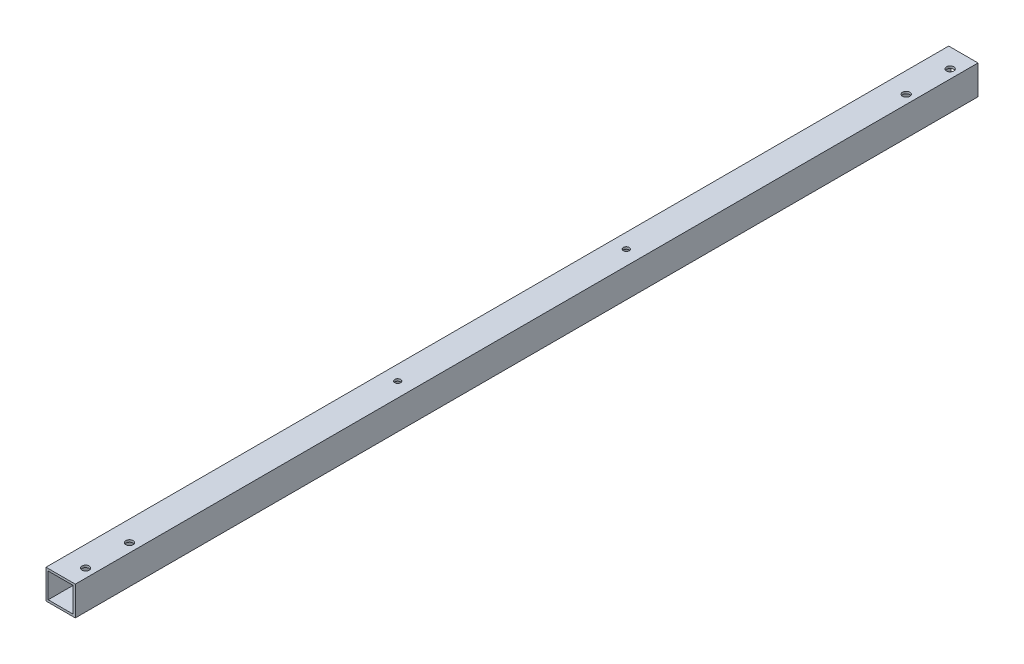
ISO-10303-21;
HEADER;
FILE_DESCRIPTION(('STEP AP214'),'2;1');
FILE_NAME('part.step','',(''),(''),'','','');
FILE_SCHEMA(('AUTOMOTIVE_DESIGN { 1 0 10303 214 1 1 1 1 }'));
ENDSEC;
DATA;
#1=APPLICATION_CONTEXT('core data for automotive mechanical design processes');
#2=APPLICATION_PROTOCOL_DEFINITION('international standard','automotive_design',2000,#1);
#3=PRODUCT_CONTEXT('',#1,'mechanical');
#4=PRODUCT('Part','Part','',(#3));
#5=PRODUCT_RELATED_PRODUCT_CATEGORY('part','',(#4));
#6=PRODUCT_DEFINITION_FORMATION('','',#4);
#7=PRODUCT_DEFINITION_CONTEXT('part definition',#1,'design');
#8=PRODUCT_DEFINITION('design','',#6,#7);
#9=PRODUCT_DEFINITION_SHAPE('','',#8);
#10=(LENGTH_UNIT() NAMED_UNIT(*) SI_UNIT(.MILLI.,.METRE.));
#11=(NAMED_UNIT(*) PLANE_ANGLE_UNIT() SI_UNIT($,.RADIAN.));
#12=(NAMED_UNIT(*) SI_UNIT($,.STERADIAN.) SOLID_ANGLE_UNIT());
#13=UNCERTAINTY_MEASURE_WITH_UNIT(LENGTH_MEASURE(1.E-05),#10,'distance_accuracy_value','');
#14=(GEOMETRIC_REPRESENTATION_CONTEXT(3) GLOBAL_UNCERTAINTY_ASSIGNED_CONTEXT((#13)) GLOBAL_UNIT_ASSIGNED_CONTEXT((#10,
#11,#12)) REPRESENTATION_CONTEXT('',''));
#15=CARTESIAN_POINT('',(0.,0.,0.));
#16=DIRECTION('',(0.,0.,1.));
#17=DIRECTION('',(1.,0.,0.));
#18=AXIS2_PLACEMENT_3D('',#15,#16,#17);
#19=CARTESIAN_POINT('',(0.,0.,616.));
#20=DIRECTION('',(0.,0.,1.));
#21=DIRECTION('',(1.,0.,0.));
#22=AXIS2_PLACEMENT_3D('',#19,#20,#21);
#23=PLANE('',#22);
#24=DIRECTION('',(0.,1.,0.));
#25=VECTOR('',#24,1.);
#26=CARTESIAN_POINT('',(10.,10.,616.));
#27=LINE('',#26,#25);
#28=CARTESIAN_POINT('',(10.,-10.,616.));
#29=VERTEX_POINT('',#28);
#30=CARTESIAN_POINT('',(10.,10.,616.));
#31=VERTEX_POINT('',#30);
#32=EDGE_CURVE('E141',#29,#31,#27,.T.);
#33=ORIENTED_EDGE('',*,*,#32,.T.);
#34=DIRECTION('',(-1.,0.,0.));
#35=VECTOR('',#34,1.);
#36=CARTESIAN_POINT('',(-10.,10.,616.));
#37=LINE('',#36,#35);
#38=CARTESIAN_POINT('',(-10.,10.,616.));
#39=VERTEX_POINT('',#38);
#40=EDGE_CURVE('E144',#31,#39,#37,.T.);
#41=ORIENTED_EDGE('',*,*,#40,.T.);
#42=DIRECTION('',(0.,-1.,0.));
#43=VECTOR('',#42,1.);
#44=CARTESIAN_POINT('',(-10.,10.,616.));
#45=LINE('',#44,#43);
#46=CARTESIAN_POINT('',(-10.,-10.,616.));
#47=VERTEX_POINT('',#46);
#48=EDGE_CURVE('E147',#39,#47,#45,.T.);
#49=ORIENTED_EDGE('',*,*,#48,.T.);
#50=DIRECTION('',(1.,0.,0.));
#51=VECTOR('',#50,1.);
#52=CARTESIAN_POINT('',(-10.,-10.,616.));
#53=LINE('',#52,#51);
#54=EDGE_CURVE('E149',#47,#29,#53,.T.);
#55=ORIENTED_EDGE('',*,*,#54,.T.);
#56=EDGE_LOOP('',(#33,#41,#49,#55));
#57=FACE_BOUND('',#56,.T.);
#58=DIRECTION('',(-1.,0.,0.));
#59=VECTOR('',#58,1.);
#60=CARTESIAN_POINT('',(-8.5,8.5,616.));
#61=LINE('',#60,#59);
#62=CARTESIAN_POINT('',(8.5,8.5,616.));
#63=VERTEX_POINT('',#62);
#64=CARTESIAN_POINT('',(-8.5,8.5,616.));
#65=VERTEX_POINT('',#64);
#66=EDGE_CURVE('E111',#63,#65,#61,.T.);
#67=ORIENTED_EDGE('',*,*,#66,.F.);
#68=DIRECTION('',(0.,1.,0.));
#69=VECTOR('',#68,1.);
#70=CARTESIAN_POINT('',(8.5,8.5,616.));
#71=LINE('',#70,#69);
#72=CARTESIAN_POINT('',(8.50000000000001,-8.5,616.));
#73=VERTEX_POINT('',#72);
#74=EDGE_CURVE('E103',#73,#63,#71,.T.);
#75=ORIENTED_EDGE('',*,*,#74,.F.);
#76=DIRECTION('',(1.,0.,0.));
#77=VECTOR('',#76,1.);
#78=CARTESIAN_POINT('',(-8.5,-8.5,616.));
#79=LINE('',#78,#77);
#80=CARTESIAN_POINT('',(-8.5,-8.5,616.));
#81=VERTEX_POINT('',#80);
#82=EDGE_CURVE('E125',#81,#73,#79,.T.);
#83=ORIENTED_EDGE('',*,*,#82,.F.);
#84=DIRECTION('',(0.,-1.,0.));
#85=VECTOR('',#84,1.);
#86=CARTESIAN_POINT('',(-8.5,8.5,616.));
#87=LINE('',#86,#85);
#88=EDGE_CURVE('E123',#65,#81,#87,.T.);
#89=ORIENTED_EDGE('',*,*,#88,.F.);
#90=EDGE_LOOP('',(#67,#75,#83,#89));
#91=FACE_BOUND('',#90,.T.);
#92=ADVANCED_FACE('F36',(#57,#91),#23,.T.);
#93=CARTESIAN_POINT('',(0.,0.,0.));
#94=DIRECTION('',(0.,0.,1.));
#95=DIRECTION('',(1.,0.,0.));
#96=AXIS2_PLACEMENT_3D('',#93,#94,#95);
#97=PLANE('',#96);
#98=DIRECTION('',(0.,1.,0.));
#99=VECTOR('',#98,1.);
#100=CARTESIAN_POINT('',(10.,10.,0.));
#101=LINE('',#100,#99);
#102=CARTESIAN_POINT('',(10.,-10.,0.));
#103=VERTEX_POINT('',#102);
#104=CARTESIAN_POINT('',(10.,10.,0.));
#105=VERTEX_POINT('',#104);
#106=EDGE_CURVE('E119',#103,#105,#101,.T.);
#107=ORIENTED_EDGE('',*,*,#106,.F.);
#108=DIRECTION('',(1.,0.,0.));
#109=VECTOR('',#108,1.);
#110=CARTESIAN_POINT('',(-10.,-10.,0.));
#111=LINE('',#110,#109);
#112=CARTESIAN_POINT('',(-10.,-10.,0.));
#113=VERTEX_POINT('',#112);
#114=EDGE_CURVE('E145',#113,#103,#111,.T.);
#115=ORIENTED_EDGE('',*,*,#114,.F.);
#116=DIRECTION('',(0.,-1.,0.));
#117=VECTOR('',#116,1.);
#118=CARTESIAN_POINT('',(-10.,10.,0.));
#119=LINE('',#118,#117);
#120=CARTESIAN_POINT('',(-10.,10.,0.));
#121=VERTEX_POINT('',#120);
#122=EDGE_CURVE('E156',#121,#113,#119,.T.);
#123=ORIENTED_EDGE('',*,*,#122,.F.);
#124=DIRECTION('',(-1.,0.,0.));
#125=VECTOR('',#124,1.);
#126=CARTESIAN_POINT('',(-10.,10.,0.));
#127=LINE('',#126,#125);
#128=EDGE_CURVE('E154',#105,#121,#127,.T.);
#129=ORIENTED_EDGE('',*,*,#128,.F.);
#130=EDGE_LOOP('',(#107,#115,#123,#129));
#131=FACE_BOUND('',#130,.T.);
#132=DIRECTION('',(0.,1.,0.));
#133=VECTOR('',#132,1.);
#134=CARTESIAN_POINT('',(8.5,8.5,0.));
#135=LINE('',#134,#133);
#136=CARTESIAN_POINT('',(8.50000000000001,-8.5,0.));
#137=VERTEX_POINT('',#136);
#138=CARTESIAN_POINT('',(8.5,8.5,0.));
#139=VERTEX_POINT('',#138);
#140=EDGE_CURVE('E61',#137,#139,#135,.T.);
#141=ORIENTED_EDGE('',*,*,#140,.T.);
#142=DIRECTION('',(-1.,0.,0.));
#143=VECTOR('',#142,1.);
#144=CARTESIAN_POINT('',(-8.5,8.5,0.));
#145=LINE('',#144,#143);
#146=CARTESIAN_POINT('',(-8.5,8.5,0.));
#147=VERTEX_POINT('',#146);
#148=EDGE_CURVE('E118',#139,#147,#145,.T.);
#149=ORIENTED_EDGE('',*,*,#148,.T.);
#150=DIRECTION('',(0.,-1.,0.));
#151=VECTOR('',#150,1.);
#152=CARTESIAN_POINT('',(-8.5,8.5,0.));
#153=LINE('',#152,#151);
#154=CARTESIAN_POINT('',(-8.5,-8.5,0.));
#155=VERTEX_POINT('',#154);
#156=EDGE_CURVE('E133',#147,#155,#153,.T.);
#157=ORIENTED_EDGE('',*,*,#156,.T.);
#158=DIRECTION('',(1.,0.,0.));
#159=VECTOR('',#158,1.);
#160=CARTESIAN_POINT('',(-8.5,-8.5,0.));
#161=LINE('',#160,#159);
#162=EDGE_CURVE('E112',#155,#137,#161,.T.);
#163=ORIENTED_EDGE('',*,*,#162,.T.);
#164=EDGE_LOOP('',(#141,#149,#157,#163));
#165=FACE_BOUND('',#164,.T.);
#166=ADVANCED_FACE('F273',(#131,#165),#97,.F.);
#167=CARTESIAN_POINT('',(10.,10.,616.));
#168=DIRECTION('',(-1.,0.,0.));
#169=DIRECTION('',(0.,0.,1.));
#170=AXIS2_PLACEMENT_3D('',#167,#168,#169);
#171=PLANE('',#170);
#172=ORIENTED_EDGE('',*,*,#106,.T.);
#173=DIRECTION('',(0.,0.,-1.));
#174=VECTOR('',#173,1.);
#175=CARTESIAN_POINT('',(10.,10.,616.));
#176=LINE('',#175,#174);
#177=EDGE_CURVE('E11',#31,#105,#176,.T.);
#178=ORIENTED_EDGE('',*,*,#177,.F.);
#179=ORIENTED_EDGE('',*,*,#32,.F.);
#180=DIRECTION('',(0.,0.,-1.));
#181=VECTOR('',#180,1.);
#182=CARTESIAN_POINT('',(10.,-10.,616.));
#183=LINE('',#182,#181);
#184=EDGE_CURVE('E151',#29,#103,#183,.T.);
#185=ORIENTED_EDGE('',*,*,#184,.T.);
#186=EDGE_LOOP('',(#172,#178,#179,#185));
#187=FACE_BOUND('',#186,.T.);
#188=ADVANCED_FACE('F38',(#187),#171,.F.);
#189=CARTESIAN_POINT('',(-10.,10.,616.));
#190=DIRECTION('',(0.,-1.,0.));
#191=DIRECTION('',(0.,0.,-1.));
#192=AXIS2_PLACEMENT_3D('',#189,#190,#191);
#193=PLANE('',#192);
#194=CARTESIAN_POINT('',(0.,10.,230.));
#195=DIRECTION('',(0.,-1.,0.));
#196=DIRECTION('',(0.,0.,-1.));
#197=AXIS2_PLACEMENT_3D('',#194,#195,#196);
#198=CIRCLE('',#197,1.99999999999999);
#199=CARTESIAN_POINT('',(0.,10.,228.));
#200=VERTEX_POINT('',#199);
#201=EDGE_CURVE('E184',#200,#200,#198,.T.);
#202=ORIENTED_EDGE('',*,*,#201,.T.);
#203=EDGE_LOOP('',(#202));
#204=FACE_BOUND('',#203,.T.);
#205=CARTESIAN_POINT('',(0.,10.,386.));
#206=DIRECTION('',(0.,-1.,0.));
#207=DIRECTION('',(0.,0.,-1.));
#208=AXIS2_PLACEMENT_3D('',#205,#206,#207);
#209=CIRCLE('',#208,1.99999999999998);
#210=CARTESIAN_POINT('',(0.,10.,384.));
#211=VERTEX_POINT('',#210);
#212=EDGE_CURVE('E195',#211,#211,#209,.T.);
#213=ORIENTED_EDGE('',*,*,#212,.T.);
#214=EDGE_LOOP('',(#213));
#215=FACE_BOUND('',#214,.T.);
#216=CARTESIAN_POINT('',(4.,10.,13.));
#217=DIRECTION('',(0.,-1.,0.));
#218=DIRECTION('',(0.,0.,-1.));
#219=AXIS2_PLACEMENT_3D('',#216,#217,#218);
#220=CIRCLE('',#219,2.5);
#221=CARTESIAN_POINT('',(4.,10.,10.5));
#222=VERTEX_POINT('',#221);
#223=EDGE_CURVE('E170',#222,#222,#220,.T.);
#224=ORIENTED_EDGE('',*,*,#223,.T.);
#225=EDGE_LOOP('',(#224));
#226=FACE_BOUND('',#225,.T.);
#227=CARTESIAN_POINT('',(4.,10.,573.));
#228=DIRECTION('',(0.,-1.,0.));
#229=DIRECTION('',(0.,0.,-1.));
#230=AXIS2_PLACEMENT_3D('',#227,#228,#229);
#231=CIRCLE('',#230,2.5);
#232=CARTESIAN_POINT('',(4.,10.,570.5));
#233=VERTEX_POINT('',#232);
#234=EDGE_CURVE('E213',#233,#233,#231,.T.);
#235=ORIENTED_EDGE('',*,*,#234,.T.);
#236=EDGE_LOOP('',(#235));
#237=FACE_BOUND('',#236,.T.);
#238=CARTESIAN_POINT('',(4.,10.,603.));
#239=DIRECTION('',(0.,-1.,0.));
#240=DIRECTION('',(0.,0.,-1.));
#241=AXIS2_PLACEMENT_3D('',#238,#239,#240);
#242=CIRCLE('',#241,2.5);
#243=CARTESIAN_POINT('',(4.,10.,600.5));
#244=VERTEX_POINT('',#243);
#245=EDGE_CURVE('E224',#244,#244,#242,.T.);
#246=ORIENTED_EDGE('',*,*,#245,.T.);
#247=EDGE_LOOP('',(#246));
#248=FACE_BOUND('',#247,.T.);
#249=CARTESIAN_POINT('',(4.,10.,43.));
#250=DIRECTION('',(0.,-1.,0.));
#251=DIRECTION('',(0.,0.,-1.));
#252=AXIS2_PLACEMENT_3D('',#249,#250,#251);
#253=CIRCLE('',#252,2.5);
#254=CARTESIAN_POINT('',(4.,10.,40.5));
#255=VERTEX_POINT('',#254);
#256=EDGE_CURVE('E212',#255,#255,#253,.T.);
#257=ORIENTED_EDGE('',*,*,#256,.T.);
#258=EDGE_LOOP('',(#257));
#259=FACE_BOUND('',#258,.T.);
#260=ORIENTED_EDGE('',*,*,#128,.T.);
#261=DIRECTION('',(0.,0.,-1.));
#262=VECTOR('',#261,1.);
#263=CARTESIAN_POINT('',(-10.,10.,616.));
#264=LINE('',#263,#262);
#265=EDGE_CURVE('E45',#39,#121,#264,.T.);
#266=ORIENTED_EDGE('',*,*,#265,.F.);
#267=ORIENTED_EDGE('',*,*,#40,.F.);
#268=ORIENTED_EDGE('',*,*,#177,.T.);
#269=EDGE_LOOP('',(#260,#266,#267,#268));
#270=FACE_BOUND('',#269,.T.);
#271=ADVANCED_FACE('F260',(#204,#215,#226,#237,#248,#259,#270),#193,.F.);
#272=CARTESIAN_POINT('',(-10.,10.,616.));
#273=DIRECTION('',(1.,0.,0.));
#274=DIRECTION('',(0.,1.,0.));
#275=AXIS2_PLACEMENT_3D('',#272,#273,#274);
#276=PLANE('',#275);
#277=ORIENTED_EDGE('',*,*,#122,.T.);
#278=DIRECTION('',(0.,0.,-1.));
#279=VECTOR('',#278,1.);
#280=CARTESIAN_POINT('',(-10.,-10.,616.));
#281=LINE('',#280,#279);
#282=EDGE_CURVE('E161',#47,#113,#281,.T.);
#283=ORIENTED_EDGE('',*,*,#282,.F.);
#284=ORIENTED_EDGE('',*,*,#48,.F.);
#285=ORIENTED_EDGE('',*,*,#265,.T.);
#286=EDGE_LOOP('',(#277,#283,#284,#285));
#287=FACE_BOUND('',#286,.T.);
#288=ADVANCED_FACE('F263',(#287),#276,.F.);
#289=CARTESIAN_POINT('',(-10.,-10.,616.));
#290=DIRECTION('',(0.,1.,0.));
#291=DIRECTION('',(0.,0.,1.));
#292=AXIS2_PLACEMENT_3D('',#289,#290,#291);
#293=PLANE('',#292);
#294=CARTESIAN_POINT('',(0.,-10.,230.));
#295=DIRECTION('',(0.,-1.,0.));
#296=DIRECTION('',(0.,0.,-1.));
#297=AXIS2_PLACEMENT_3D('',#294,#295,#296);
#298=CIRCLE('',#297,1.99999999999999);
#299=CARTESIAN_POINT('',(0.,-10.,228.));
#300=VERTEX_POINT('',#299);
#301=EDGE_CURVE('E190',#300,#300,#298,.T.);
#302=ORIENTED_EDGE('',*,*,#301,.F.);
#303=EDGE_LOOP('',(#302));
#304=FACE_BOUND('',#303,.T.);
#305=CARTESIAN_POINT('',(0.,-10.,386.));
#306=DIRECTION('',(0.,-1.,0.));
#307=DIRECTION('',(0.,0.,-1.));
#308=AXIS2_PLACEMENT_3D('',#305,#306,#307);
#309=CIRCLE('',#308,1.99999999999998);
#310=CARTESIAN_POINT('',(0.,-10.,384.));
#311=VERTEX_POINT('',#310);
#312=EDGE_CURVE('E200',#311,#311,#309,.T.);
#313=ORIENTED_EDGE('',*,*,#312,.F.);
#314=EDGE_LOOP('',(#313));
#315=FACE_BOUND('',#314,.T.);
#316=CARTESIAN_POINT('',(4.,-10.,13.));
#317=DIRECTION('',(0.,-1.,0.));
#318=DIRECTION('',(0.,0.,-1.));
#319=AXIS2_PLACEMENT_3D('',#316,#317,#318);
#320=CIRCLE('',#319,2.5);
#321=CARTESIAN_POINT('',(4.,-10.,10.5));
#322=VERTEX_POINT('',#321);
#323=EDGE_CURVE('E209',#322,#322,#320,.T.);
#324=ORIENTED_EDGE('',*,*,#323,.F.);
#325=EDGE_LOOP('',(#324));
#326=FACE_BOUND('',#325,.T.);
#327=CARTESIAN_POINT('',(4.,-10.,573.));
#328=DIRECTION('',(0.,-1.,0.));
#329=DIRECTION('',(0.,0.,-1.));
#330=AXIS2_PLACEMENT_3D('',#327,#328,#329);
#331=CIRCLE('',#330,2.5);
#332=CARTESIAN_POINT('',(4.,-10.,570.5));
#333=VERTEX_POINT('',#332);
#334=EDGE_CURVE('E206',#333,#333,#331,.T.);
#335=ORIENTED_EDGE('',*,*,#334,.F.);
#336=EDGE_LOOP('',(#335));
#337=FACE_BOUND('',#336,.T.);
#338=CARTESIAN_POINT('',(4.,-10.,603.));
#339=DIRECTION('',(0.,-1.,0.));
#340=DIRECTION('',(0.,0.,-1.));
#341=AXIS2_PLACEMENT_3D('',#338,#339,#340);
#342=CIRCLE('',#341,2.5);
#343=CARTESIAN_POINT('',(4.,-10.,600.5));
#344=VERTEX_POINT('',#343);
#345=EDGE_CURVE('E216',#344,#344,#342,.T.);
#346=ORIENTED_EDGE('',*,*,#345,.F.);
#347=EDGE_LOOP('',(#346));
#348=FACE_BOUND('',#347,.T.);
#349=CARTESIAN_POINT('',(4.,-10.,43.));
#350=DIRECTION('',(0.,-1.,0.));
#351=DIRECTION('',(0.,0.,-1.));
#352=AXIS2_PLACEMENT_3D('',#349,#350,#351);
#353=CIRCLE('',#352,2.5);
#354=CARTESIAN_POINT('',(4.,-10.,40.5));
#355=VERTEX_POINT('',#354);
#356=EDGE_CURVE('E221',#355,#355,#353,.T.);
#357=ORIENTED_EDGE('',*,*,#356,.F.);
#358=EDGE_LOOP('',(#357));
#359=FACE_BOUND('',#358,.T.);
#360=ORIENTED_EDGE('',*,*,#114,.T.);
#361=ORIENTED_EDGE('',*,*,#184,.F.);
#362=ORIENTED_EDGE('',*,*,#54,.F.);
#363=ORIENTED_EDGE('',*,*,#282,.T.);
#364=EDGE_LOOP('',(#360,#361,#362,#363));
#365=FACE_BOUND('',#364,.T.);
#366=ADVANCED_FACE('F277',(#304,#315,#326,#337,#348,#359,#365),#293,.F.);
#367=CARTESIAN_POINT('',(8.5,8.5,616.));
#368=DIRECTION('',(-1.,0.,0.));
#369=DIRECTION('',(0.,-1.,0.));
#370=AXIS2_PLACEMENT_3D('',#367,#368,#369);
#371=PLANE('',#370);
#372=ORIENTED_EDGE('',*,*,#140,.F.);
#373=DIRECTION('',(0.,0.,-1.));
#374=VECTOR('',#373,1.);
#375=CARTESIAN_POINT('',(8.50000000000001,-8.5,616.));
#376=LINE('',#375,#374);
#377=EDGE_CURVE('E107',#73,#137,#376,.T.);
#378=ORIENTED_EDGE('',*,*,#377,.F.);
#379=ORIENTED_EDGE('',*,*,#74,.T.);
#380=DIRECTION('',(0.,0.,-1.));
#381=VECTOR('',#380,1.);
#382=CARTESIAN_POINT('',(8.5,8.5,616.));
#383=LINE('',#382,#381);
#384=EDGE_CURVE('E106',#63,#139,#383,.T.);
#385=ORIENTED_EDGE('',*,*,#384,.T.);
#386=EDGE_LOOP('',(#372,#378,#379,#385));
#387=FACE_BOUND('',#386,.T.);
#388=ADVANCED_FACE('F105',(#387),#371,.T.);
#389=CARTESIAN_POINT('',(-8.5,8.5,616.));
#390=DIRECTION('',(0.,-1.,0.));
#391=DIRECTION('',(0.,0.,-1.));
#392=AXIS2_PLACEMENT_3D('',#389,#390,#391);
#393=PLANE('',#392);
#394=CARTESIAN_POINT('',(0.,8.5,230.));
#395=DIRECTION('',(0.,-1.,0.));
#396=DIRECTION('',(0.,0.,-1.));
#397=AXIS2_PLACEMENT_3D('',#394,#395,#396);
#398=CIRCLE('',#397,1.99999999999999);
#399=CARTESIAN_POINT('',(0.,8.5,228.));
#400=VERTEX_POINT('',#399);
#401=EDGE_CURVE('E203',#400,#400,#398,.T.);
#402=ORIENTED_EDGE('',*,*,#401,.F.);
#403=EDGE_LOOP('',(#402));
#404=FACE_BOUND('',#403,.T.);
#405=CARTESIAN_POINT('',(0.,8.5,386.));
#406=DIRECTION('',(0.,-1.,0.));
#407=DIRECTION('',(0.,0.,-1.));
#408=AXIS2_PLACEMENT_3D('',#405,#406,#407);
#409=CIRCLE('',#408,1.99999999999998);
#410=CARTESIAN_POINT('',(0.,8.5,384.));
#411=VERTEX_POINT('',#410);
#412=EDGE_CURVE('E183',#411,#411,#409,.T.);
#413=ORIENTED_EDGE('',*,*,#412,.F.);
#414=EDGE_LOOP('',(#413));
#415=FACE_BOUND('',#414,.T.);
#416=CARTESIAN_POINT('',(4.,8.5,13.));
#417=DIRECTION('',(0.,-1.,0.));
#418=DIRECTION('',(0.,0.,-1.));
#419=AXIS2_PLACEMENT_3D('',#416,#417,#418);
#420=CIRCLE('',#419,2.5);
#421=CARTESIAN_POINT('',(4.,8.5,10.5));
#422=VERTEX_POINT('',#421);
#423=EDGE_CURVE('E131',#422,#422,#420,.T.);
#424=ORIENTED_EDGE('',*,*,#423,.F.);
#425=EDGE_LOOP('',(#424));
#426=FACE_BOUND('',#425,.T.);
#427=CARTESIAN_POINT('',(4.,8.5,573.));
#428=DIRECTION('',(0.,-1.,0.));
#429=DIRECTION('',(0.,0.,-1.));
#430=AXIS2_PLACEMENT_3D('',#427,#428,#429);
#431=CIRCLE('',#430,2.5);
#432=CARTESIAN_POINT('',(4.,8.5,570.5));
#433=VERTEX_POINT('',#432);
#434=EDGE_CURVE('E178',#433,#433,#431,.T.);
#435=ORIENTED_EDGE('',*,*,#434,.F.);
#436=EDGE_LOOP('',(#435));
#437=FACE_BOUND('',#436,.T.);
#438=CARTESIAN_POINT('',(4.,8.5,603.));
#439=DIRECTION('',(0.,-1.,0.));
#440=DIRECTION('',(0.,0.,-1.));
#441=AXIS2_PLACEMENT_3D('',#438,#439,#440);
#442=CIRCLE('',#441,2.5);
#443=CARTESIAN_POINT('',(4.,8.5,600.5));
#444=VERTEX_POINT('',#443);
#445=EDGE_CURVE('E174',#444,#444,#442,.T.);
#446=ORIENTED_EDGE('',*,*,#445,.F.);
#447=EDGE_LOOP('',(#446));
#448=FACE_BOUND('',#447,.T.);
#449=CARTESIAN_POINT('',(4.,8.5,43.));
#450=DIRECTION('',(0.,-1.,0.));
#451=DIRECTION('',(0.,0.,-1.));
#452=AXIS2_PLACEMENT_3D('',#449,#450,#451);
#453=CIRCLE('',#452,2.5);
#454=CARTESIAN_POINT('',(4.,8.5,40.5));
#455=VERTEX_POINT('',#454);
#456=EDGE_CURVE('E169',#455,#455,#453,.T.);
#457=ORIENTED_EDGE('',*,*,#456,.F.);
#458=EDGE_LOOP('',(#457));
#459=FACE_BOUND('',#458,.T.);
#460=ORIENTED_EDGE('',*,*,#148,.F.);
#461=ORIENTED_EDGE('',*,*,#384,.F.);
#462=ORIENTED_EDGE('',*,*,#66,.T.);
#463=DIRECTION('',(0.,0.,-1.));
#464=VECTOR('',#463,1.);
#465=CARTESIAN_POINT('',(-8.5,8.5,616.));
#466=LINE('',#465,#464);
#467=EDGE_CURVE('E120',#65,#147,#466,.T.);
#468=ORIENTED_EDGE('',*,*,#467,.T.);
#469=EDGE_LOOP('',(#460,#461,#462,#468));
#470=FACE_BOUND('',#469,.T.);
#471=ADVANCED_FACE('F115',(#404,#415,#426,#437,#448,#459,#470),#393,.T.);
#472=CARTESIAN_POINT('',(-8.5,8.5,616.));
#473=DIRECTION('',(1.,0.,0.));
#474=DIRECTION('',(0.,1.,0.));
#475=AXIS2_PLACEMENT_3D('',#472,#473,#474);
#476=PLANE('',#475);
#477=ORIENTED_EDGE('',*,*,#156,.F.);
#478=ORIENTED_EDGE('',*,*,#467,.F.);
#479=ORIENTED_EDGE('',*,*,#88,.T.);
#480=DIRECTION('',(0.,0.,-1.));
#481=VECTOR('',#480,1.);
#482=CARTESIAN_POINT('',(-8.5,-8.5,616.));
#483=LINE('',#482,#481);
#484=EDGE_CURVE('E53',#81,#155,#483,.T.);
#485=ORIENTED_EDGE('',*,*,#484,.T.);
#486=EDGE_LOOP('',(#477,#478,#479,#485));
#487=FACE_BOUND('',#486,.T.);
#488=ADVANCED_FACE('F242',(#487),#476,.T.);
#489=CARTESIAN_POINT('',(-8.5,-8.5,616.));
#490=DIRECTION('',(0.,1.,0.));
#491=DIRECTION('',(0.,0.,1.));
#492=AXIS2_PLACEMENT_3D('',#489,#490,#491);
#493=PLANE('',#492);
#494=CARTESIAN_POINT('',(0.,-8.5,230.));
#495=DIRECTION('',(0.,1.,0.));
#496=DIRECTION('',(0.,0.,1.));
#497=AXIS2_PLACEMENT_3D('',#494,#495,#496);
#498=CIRCLE('',#497,1.99999999999999);
#499=CARTESIAN_POINT('',(0.,-8.5,232.));
#500=VERTEX_POINT('',#499);
#501=EDGE_CURVE('E40',#500,#500,#498,.T.);
#502=ORIENTED_EDGE('',*,*,#501,.F.);
#503=EDGE_LOOP('',(#502));
#504=FACE_BOUND('',#503,.T.);
#505=CARTESIAN_POINT('',(0.,-8.5,386.));
#506=DIRECTION('',(0.,1.,0.));
#507=DIRECTION('',(0.,0.,1.));
#508=AXIS2_PLACEMENT_3D('',#505,#506,#507);
#509=CIRCLE('',#508,1.99999999999998);
#510=CARTESIAN_POINT('',(0.,-8.5,388.));
#511=VERTEX_POINT('',#510);
#512=EDGE_CURVE('E181',#511,#511,#509,.T.);
#513=ORIENTED_EDGE('',*,*,#512,.F.);
#514=EDGE_LOOP('',(#513));
#515=FACE_BOUND('',#514,.T.);
#516=CARTESIAN_POINT('',(4.,-8.5,13.));
#517=DIRECTION('',(0.,1.,0.));
#518=DIRECTION('',(0.,0.,1.));
#519=AXIS2_PLACEMENT_3D('',#516,#517,#518);
#520=CIRCLE('',#519,2.5);
#521=CARTESIAN_POINT('',(4.,-8.5,15.5));
#522=VERTEX_POINT('',#521);
#523=EDGE_CURVE('E179',#522,#522,#520,.T.);
#524=ORIENTED_EDGE('',*,*,#523,.F.);
#525=EDGE_LOOP('',(#524));
#526=FACE_BOUND('',#525,.T.);
#527=CARTESIAN_POINT('',(4.,-8.5,573.));
#528=DIRECTION('',(0.,1.,0.));
#529=DIRECTION('',(0.,0.,1.));
#530=AXIS2_PLACEMENT_3D('',#527,#528,#529);
#531=CIRCLE('',#530,2.5);
#532=CARTESIAN_POINT('',(4.,-8.5,575.5));
#533=VERTEX_POINT('',#532);
#534=EDGE_CURVE('E175',#533,#533,#531,.T.);
#535=ORIENTED_EDGE('',*,*,#534,.F.);
#536=EDGE_LOOP('',(#535));
#537=FACE_BOUND('',#536,.T.);
#538=CARTESIAN_POINT('',(4.,-8.5,603.));
#539=DIRECTION('',(0.,1.,0.));
#540=DIRECTION('',(0.,0.,1.));
#541=AXIS2_PLACEMENT_3D('',#538,#539,#540);
#542=CIRCLE('',#541,2.5);
#543=CARTESIAN_POINT('',(4.,-8.5,605.5));
#544=VERTEX_POINT('',#543);
#545=EDGE_CURVE('E171',#544,#544,#542,.T.);
#546=ORIENTED_EDGE('',*,*,#545,.F.);
#547=EDGE_LOOP('',(#546));
#548=FACE_BOUND('',#547,.T.);
#549=CARTESIAN_POINT('',(4.,-8.5,43.));
#550=DIRECTION('',(0.,1.,0.));
#551=DIRECTION('',(0.,0.,1.));
#552=AXIS2_PLACEMENT_3D('',#549,#550,#551);
#553=CIRCLE('',#552,2.5);
#554=CARTESIAN_POINT('',(4.,-8.5,45.5));
#555=VERTEX_POINT('',#554);
#556=EDGE_CURVE('E166',#555,#555,#553,.T.);
#557=ORIENTED_EDGE('',*,*,#556,.F.);
#558=EDGE_LOOP('',(#557));
#559=FACE_BOUND('',#558,.T.);
#560=ORIENTED_EDGE('',*,*,#162,.F.);
#561=ORIENTED_EDGE('',*,*,#484,.F.);
#562=ORIENTED_EDGE('',*,*,#82,.T.);
#563=ORIENTED_EDGE('',*,*,#377,.T.);
#564=EDGE_LOOP('',(#560,#561,#562,#563));
#565=FACE_BOUND('',#564,.T.);
#566=ADVANCED_FACE('F320',(#504,#515,#526,#537,#548,#559,#565),#493,.T.);
#567=CARTESIAN_POINT('',(4.,10.,43.));
#568=DIRECTION('',(0.,-1.,0.));
#569=DIRECTION('',(0.,0.,-1.));
#570=AXIS2_PLACEMENT_3D('',#567,#568,#569);
#571=CYLINDRICAL_SURFACE('',#570,2.5);
#572=ORIENTED_EDGE('',*,*,#556,.T.);
#573=EDGE_LOOP('',(#572));
#574=FACE_BOUND('',#573,.T.);
#575=ORIENTED_EDGE('',*,*,#356,.T.);
#576=EDGE_LOOP('',(#575));
#577=FACE_BOUND('',#576,.T.);
#578=ADVANCED_FACE('F257',(#574,#577),#571,.F.);
#579=CARTESIAN_POINT('',(4.,10.,603.));
#580=DIRECTION('',(0.,-1.,0.));
#581=DIRECTION('',(0.,0.,-1.));
#582=AXIS2_PLACEMENT_3D('',#579,#580,#581);
#583=CYLINDRICAL_SURFACE('',#582,2.5);
#584=ORIENTED_EDGE('',*,*,#545,.T.);
#585=EDGE_LOOP('',(#584));
#586=FACE_BOUND('',#585,.T.);
#587=ORIENTED_EDGE('',*,*,#345,.T.);
#588=EDGE_LOOP('',(#587));
#589=FACE_BOUND('',#588,.T.);
#590=ADVANCED_FACE('F335',(#586,#589),#583,.F.);
#591=CARTESIAN_POINT('',(4.,10.,573.));
#592=DIRECTION('',(0.,-1.,0.));
#593=DIRECTION('',(0.,0.,-1.));
#594=AXIS2_PLACEMENT_3D('',#591,#592,#593);
#595=CYLINDRICAL_SURFACE('',#594,2.5);
#596=ORIENTED_EDGE('',*,*,#534,.T.);
#597=EDGE_LOOP('',(#596));
#598=FACE_BOUND('',#597,.T.);
#599=ORIENTED_EDGE('',*,*,#334,.T.);
#600=EDGE_LOOP('',(#599));
#601=FACE_BOUND('',#600,.T.);
#602=ADVANCED_FACE('F342',(#598,#601),#595,.F.);
#603=CARTESIAN_POINT('',(4.,10.,13.));
#604=DIRECTION('',(0.,-1.,0.));
#605=DIRECTION('',(0.,0.,-1.));
#606=AXIS2_PLACEMENT_3D('',#603,#604,#605);
#607=CYLINDRICAL_SURFACE('',#606,2.5);
#608=ORIENTED_EDGE('',*,*,#523,.T.);
#609=EDGE_LOOP('',(#608));
#610=FACE_BOUND('',#609,.T.);
#611=ORIENTED_EDGE('',*,*,#323,.T.);
#612=EDGE_LOOP('',(#611));
#613=FACE_BOUND('',#612,.T.);
#614=ADVANCED_FACE('F255',(#610,#613),#607,.F.);
#615=ORIENTED_EDGE('',*,*,#456,.T.);
#616=EDGE_LOOP('',(#615));
#617=FACE_BOUND('',#616,.T.);
#618=ORIENTED_EDGE('',*,*,#256,.F.);
#619=EDGE_LOOP('',(#618));
#620=FACE_BOUND('',#619,.T.);
#621=ADVANCED_FACE('F251',(#617,#620),#571,.F.);
#622=ORIENTED_EDGE('',*,*,#445,.T.);
#623=EDGE_LOOP('',(#622));
#624=FACE_BOUND('',#623,.T.);
#625=ORIENTED_EDGE('',*,*,#245,.F.);
#626=EDGE_LOOP('',(#625));
#627=FACE_BOUND('',#626,.T.);
#628=ADVANCED_FACE('F254',(#624,#627),#583,.F.);
#629=ORIENTED_EDGE('',*,*,#434,.T.);
#630=EDGE_LOOP('',(#629));
#631=FACE_BOUND('',#630,.T.);
#632=ORIENTED_EDGE('',*,*,#234,.F.);
#633=EDGE_LOOP('',(#632));
#634=FACE_BOUND('',#633,.T.);
#635=ADVANCED_FACE('F352',(#631,#634),#595,.F.);
#636=ORIENTED_EDGE('',*,*,#423,.T.);
#637=EDGE_LOOP('',(#636));
#638=FACE_BOUND('',#637,.T.);
#639=ORIENTED_EDGE('',*,*,#223,.F.);
#640=EDGE_LOOP('',(#639));
#641=FACE_BOUND('',#640,.T.);
#642=ADVANCED_FACE('F237',(#638,#641),#607,.F.);
#643=CARTESIAN_POINT('',(0.,10.,386.));
#644=DIRECTION('',(0.,-1.,0.));
#645=DIRECTION('',(0.,0.,-1.));
#646=AXIS2_PLACEMENT_3D('',#643,#644,#645);
#647=CYLINDRICAL_SURFACE('',#646,1.99999999999998);
#648=ORIENTED_EDGE('',*,*,#512,.T.);
#649=EDGE_LOOP('',(#648));
#650=FACE_BOUND('',#649,.T.);
#651=ORIENTED_EDGE('',*,*,#312,.T.);
#652=EDGE_LOOP('',(#651));
#653=FACE_BOUND('',#652,.T.);
#654=ADVANCED_FACE('F381',(#650,#653),#647,.F.);
#655=CARTESIAN_POINT('',(0.,10.,230.));
#656=DIRECTION('',(0.,-1.,0.));
#657=DIRECTION('',(0.,0.,-1.));
#658=AXIS2_PLACEMENT_3D('',#655,#656,#657);
#659=CYLINDRICAL_SURFACE('',#658,1.99999999999999);
#660=ORIENTED_EDGE('',*,*,#501,.T.);
#661=EDGE_LOOP('',(#660));
#662=FACE_BOUND('',#661,.T.);
#663=ORIENTED_EDGE('',*,*,#301,.T.);
#664=EDGE_LOOP('',(#663));
#665=FACE_BOUND('',#664,.T.);
#666=ADVANCED_FACE('F386',(#662,#665),#659,.F.);
#667=ORIENTED_EDGE('',*,*,#412,.T.);
#668=EDGE_LOOP('',(#667));
#669=FACE_BOUND('',#668,.T.);
#670=ORIENTED_EDGE('',*,*,#212,.F.);
#671=EDGE_LOOP('',(#670));
#672=FACE_BOUND('',#671,.T.);
#673=ADVANCED_FACE('F388',(#669,#672),#647,.F.);
#674=ORIENTED_EDGE('',*,*,#401,.T.);
#675=EDGE_LOOP('',(#674));
#676=FACE_BOUND('',#675,.T.);
#677=ORIENTED_EDGE('',*,*,#201,.F.);
#678=EDGE_LOOP('',(#677));
#679=FACE_BOUND('',#678,.T.);
#680=ADVANCED_FACE('F396',(#676,#679),#659,.F.);
#681=CLOSED_SHELL('',(#92,#166,#188,#271,#288,#366,#388,#471,#488,#566,#578,#590,#602,#614,#621,
#628,#635,#642,#654,#666,#673,#680));
#682=MANIFOLD_SOLID_BREP('B2',#681);
#683=ADVANCED_BREP_SHAPE_REPRESENTATION('',(#18,#682),#14);
#684=SHAPE_DEFINITION_REPRESENTATION(#9,#683);
ENDSEC;
END-ISO-10303-21;
